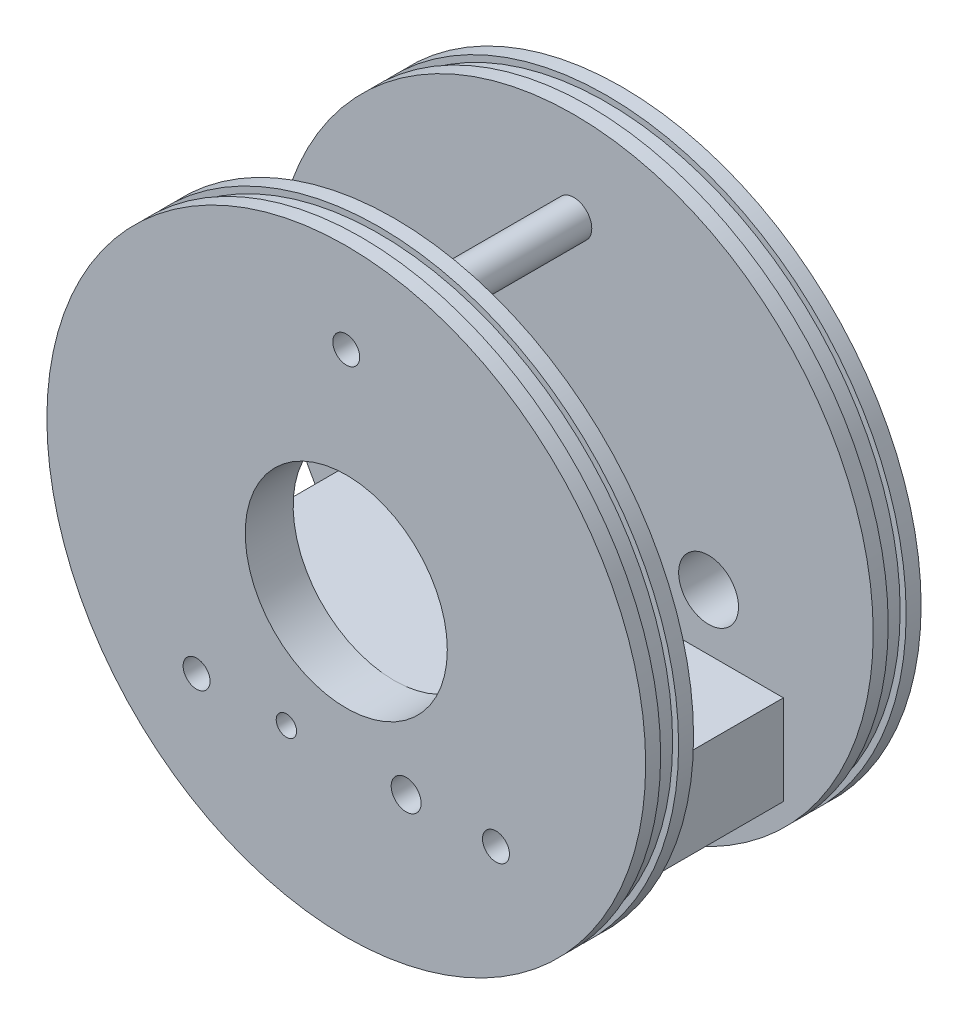
ISO-10303-21;
HEADER;
FILE_DESCRIPTION(('STEP AP214'),'2;1');
FILE_NAME('part.step','',(''),(''),'','','');
FILE_SCHEMA(('AUTOMOTIVE_DESIGN { 1 0 10303 214 1 1 1 1 }'));
ENDSEC;
DATA;
#1=APPLICATION_CONTEXT('core data for automotive mechanical design processes');
#2=APPLICATION_PROTOCOL_DEFINITION('international standard','automotive_design',2000,#1);
#3=PRODUCT_CONTEXT('',#1,'mechanical');
#4=PRODUCT('Part','Part','',(#3));
#5=PRODUCT_RELATED_PRODUCT_CATEGORY('part','',(#4));
#6=PRODUCT_DEFINITION_FORMATION('','',#4);
#7=PRODUCT_DEFINITION_CONTEXT('part definition',#1,'design');
#8=PRODUCT_DEFINITION('design','',#6,#7);
#9=PRODUCT_DEFINITION_SHAPE('','',#8);
#10=(LENGTH_UNIT() NAMED_UNIT(*) SI_UNIT(.MILLI.,.METRE.));
#11=(NAMED_UNIT(*) PLANE_ANGLE_UNIT() SI_UNIT($,.RADIAN.));
#12=(NAMED_UNIT(*) SI_UNIT($,.STERADIAN.) SOLID_ANGLE_UNIT());
#13=UNCERTAINTY_MEASURE_WITH_UNIT(LENGTH_MEASURE(1.E-05),#10,'distance_accuracy_value','');
#14=(GEOMETRIC_REPRESENTATION_CONTEXT(3) GLOBAL_UNCERTAINTY_ASSIGNED_CONTEXT((#13)) GLOBAL_UNIT_ASSIGNED_CONTEXT((#10,
#11,#12)) REPRESENTATION_CONTEXT('',''));
#15=CARTESIAN_POINT('',(0.,0.,0.));
#16=DIRECTION('',(0.,0.,1.));
#17=DIRECTION('',(1.,0.,0.));
#18=AXIS2_PLACEMENT_3D('',#15,#16,#17);
#19=CARTESIAN_POINT('',(0.,0.,-68.));
#20=DIRECTION('',(0.,0.,1.));
#21=DIRECTION('',(1.,0.,0.));
#22=AXIS2_PLACEMENT_3D('',#19,#20,#21);
#23=PLANE('',#22);
#24=CARTESIAN_POINT('',(45.,-15.,-68.));
#25=DIRECTION('',(0.,0.,1.));
#26=DIRECTION('',(1.,0.,0.));
#27=AXIS2_PLACEMENT_3D('',#24,#25,#26);
#28=CIRCLE('',#27,10.);
#29=CARTESIAN_POINT('',(55.,-15.,-68.));
#30=VERTEX_POINT('',#29);
#31=EDGE_CURVE('E337',#30,#30,#28,.T.);
#32=ORIENTED_EDGE('',*,*,#31,.F.);
#33=EDGE_LOOP('',(#32));
#34=FACE_BOUND('',#33,.T.);
#35=CARTESIAN_POINT('',(0.,0.,-68.));
#36=DIRECTION('',(0.,0.,1.));
#37=DIRECTION('',(1.,0.,0.));
#38=AXIS2_PLACEMENT_3D('',#35,#36,#37);
#39=CIRCLE('',#38,99.9999999999943);
#40=CARTESIAN_POINT('',(99.9999999999943,0.,-68.));
#41=VERTEX_POINT('',#40);
#42=EDGE_CURVE('E83',#41,#41,#39,.T.);
#43=ORIENTED_EDGE('',*,*,#42,.T.);
#44=EDGE_LOOP('',(#43));
#45=FACE_BOUND('',#44,.T.);
#46=CARTESIAN_POINT('',(0.,70.,-68.));
#47=DIRECTION('',(0.,0.,-1.));
#48=DIRECTION('',(-1.,0.,0.));
#49=AXIS2_PLACEMENT_3D('',#46,#47,#48);
#50=CIRCLE('',#49,6.);
#51=CARTESIAN_POINT('',(-6.,70.,-68.));
#52=VERTEX_POINT('',#51);
#53=EDGE_CURVE('E183',#52,#52,#50,.T.);
#54=ORIENTED_EDGE('',*,*,#53,.T.);
#55=EDGE_LOOP('',(#54));
#56=FACE_BOUND('',#55,.T.);
#57=DIRECTION('',(0.,1.,0.));
#58=VECTOR('',#57,1.);
#59=CARTESIAN_POINT('',(70.,-63.75,-68.));
#60=LINE('',#59,#58);
#61=CARTESIAN_POINT('',(70.,-63.75,-68.));
#62=VERTEX_POINT('',#61);
#63=CARTESIAN_POINT('',(70.,-33.75,-68.));
#64=VERTEX_POINT('',#63);
#65=EDGE_CURVE('E91',#62,#64,#60,.T.);
#66=ORIENTED_EDGE('',*,*,#65,.F.);
#67=DIRECTION('',(-1.,0.,0.));
#68=VECTOR('',#67,1.);
#69=CARTESIAN_POINT('',(70.,-63.75,-68.));
#70=LINE('',#69,#68);
#71=CARTESIAN_POINT('',(-70.,-63.7499999999999,-68.));
#72=VERTEX_POINT('',#71);
#73=EDGE_CURVE('E95',#62,#72,#70,.T.);
#74=ORIENTED_EDGE('',*,*,#73,.T.);
#75=DIRECTION('',(0.,1.,0.));
#76=VECTOR('',#75,1.);
#77=CARTESIAN_POINT('',(-70.,-63.7499999999999,-68.));
#78=LINE('',#77,#76);
#79=CARTESIAN_POINT('',(-70.,-33.7499999999999,-68.));
#80=VERTEX_POINT('',#79);
#81=EDGE_CURVE('E135',#72,#80,#78,.T.);
#82=ORIENTED_EDGE('',*,*,#81,.T.);
#83=DIRECTION('',(-1.,0.,0.));
#84=VECTOR('',#83,1.);
#85=CARTESIAN_POINT('',(70.,-33.75,-68.));
#86=LINE('',#85,#84);
#87=EDGE_CURVE('E270',#64,#80,#86,.T.);
#88=ORIENTED_EDGE('',*,*,#87,.F.);
#89=EDGE_LOOP('',(#66,#74,#82,#88));
#90=FACE_BOUND('',#89,.T.);
#91=ADVANCED_FACE('F73',(#34,#45,#56,#90),#23,.T.);
#92=CARTESIAN_POINT('',(0.,0.,-84.));
#93=DIRECTION('',(0.,0.,1.));
#94=DIRECTION('',(1.,0.,0.));
#95=AXIS2_PLACEMENT_3D('',#92,#93,#94);
#96=CYLINDRICAL_SURFACE('',#95,99.9999999999943);
#97=CARTESIAN_POINT('',(0.,0.,-73.));
#98=DIRECTION('',(0.,0.,1.));
#99=DIRECTION('',(1.,0.,0.));
#100=AXIS2_PLACEMENT_3D('',#97,#98,#99);
#101=CIRCLE('',#100,99.9999999999943);
#102=CARTESIAN_POINT('',(99.9999999999943,0.,-73.));
#103=VERTEX_POINT('',#102);
#104=EDGE_CURVE('E201',#103,#103,#101,.T.);
#105=ORIENTED_EDGE('',*,*,#104,.T.);
#106=EDGE_LOOP('',(#105));
#107=FACE_BOUND('',#106,.T.);
#108=ORIENTED_EDGE('',*,*,#42,.F.);
#109=EDGE_LOOP('',(#108));
#110=FACE_BOUND('',#109,.T.);
#111=ADVANCED_FACE('F75',(#107,#110),#96,.T.);
#112=CARTESIAN_POINT('',(0.,0.,-73.));
#113=DIRECTION('',(0.,0.,1.));
#114=DIRECTION('',(1.,0.,0.));
#115=AXIS2_PLACEMENT_3D('',#112,#113,#114);
#116=PLANE('',#115);
#117=ORIENTED_EDGE('',*,*,#104,.F.);
#118=EDGE_LOOP('',(#117));
#119=FACE_BOUND('',#118,.T.);
#120=CARTESIAN_POINT('',(0.,0.,-73.));
#121=DIRECTION('',(0.,0.,1.));
#122=DIRECTION('',(1.,0.,0.));
#123=AXIS2_PLACEMENT_3D('',#120,#121,#122);
#124=CIRCLE('',#123,97.999999999999);
#125=CARTESIAN_POINT('',(97.999999999999,0.,-73.));
#126=VERTEX_POINT('',#125);
#127=EDGE_CURVE('E197',#126,#126,#124,.T.);
#128=ORIENTED_EDGE('',*,*,#127,.T.);
#129=EDGE_LOOP('',(#128));
#130=FACE_BOUND('',#129,.T.);
#131=ADVANCED_FACE('F303',(#119,#130),#116,.F.);
#132=CARTESIAN_POINT('',(0.,0.,-73.));
#133=DIRECTION('',(0.,0.,-1.));
#134=DIRECTION('',(-1.,0.,0.));
#135=AXIS2_PLACEMENT_3D('',#132,#133,#134);
#136=CYLINDRICAL_SURFACE('',#135,97.999999999999);
#137=ORIENTED_EDGE('',*,*,#127,.F.);
#138=EDGE_LOOP('',(#137));
#139=FACE_BOUND('',#138,.T.);
#140=CARTESIAN_POINT('',(0.,0.,-79.));
#141=DIRECTION('',(0.,0.,1.));
#142=DIRECTION('',(1.,0.,0.));
#143=AXIS2_PLACEMENT_3D('',#140,#141,#142);
#144=CIRCLE('',#143,97.999999999999);
#145=CARTESIAN_POINT('',(97.999999999999,0.,-79.));
#146=VERTEX_POINT('',#145);
#147=EDGE_CURVE('E188',#146,#146,#144,.T.);
#148=ORIENTED_EDGE('',*,*,#147,.T.);
#149=EDGE_LOOP('',(#148));
#150=FACE_BOUND('',#149,.T.);
#151=ADVANCED_FACE('F319',(#139,#150),#136,.T.);
#152=CARTESIAN_POINT('',(0.,0.,-79.));
#153=DIRECTION('',(0.,0.,1.));
#154=DIRECTION('',(1.,0.,0.));
#155=AXIS2_PLACEMENT_3D('',#152,#153,#154);
#156=PLANE('',#155);
#157=ORIENTED_EDGE('',*,*,#147,.F.);
#158=EDGE_LOOP('',(#157));
#159=FACE_BOUND('',#158,.T.);
#160=CARTESIAN_POINT('',(0.,0.,-79.));
#161=DIRECTION('',(0.,0.,1.));
#162=DIRECTION('',(1.,0.,0.));
#163=AXIS2_PLACEMENT_3D('',#160,#161,#162);
#164=CIRCLE('',#163,99.9999999999943);
#165=CARTESIAN_POINT('',(99.9999999999943,0.,-79.));
#166=VERTEX_POINT('',#165);
#167=EDGE_CURVE('E192',#166,#166,#164,.T.);
#168=ORIENTED_EDGE('',*,*,#167,.T.);
#169=EDGE_LOOP('',(#168));
#170=FACE_BOUND('',#169,.T.);
#171=ADVANCED_FACE('F311',(#159,#170),#156,.T.);
#172=CARTESIAN_POINT('',(0.,0.,-84.));
#173=DIRECTION('',(0.,0.,1.));
#174=DIRECTION('',(1.,0.,0.));
#175=AXIS2_PLACEMENT_3D('',#172,#173,#174);
#176=PLANE('',#175);
#177=CARTESIAN_POINT('',(45.,-15.,-84.));
#178=DIRECTION('',(0.,0.,-1.));
#179=DIRECTION('',(-1.,0.,0.));
#180=AXIS2_PLACEMENT_3D('',#177,#178,#179);
#181=CIRCLE('',#180,10.);
#182=CARTESIAN_POINT('',(35.,-15.,-84.));
#183=VERTEX_POINT('',#182);
#184=EDGE_CURVE('E325',#183,#183,#181,.T.);
#185=ORIENTED_EDGE('',*,*,#184,.F.);
#186=EDGE_LOOP('',(#185));
#187=FACE_BOUND('',#186,.T.);
#188=CARTESIAN_POINT('',(0.,70.,-84.));
#189=DIRECTION('',(0.,0.,1.));
#190=DIRECTION('',(1.,0.,0.));
#191=AXIS2_PLACEMENT_3D('',#188,#189,#190);
#192=CIRCLE('',#191,4.5);
#193=CARTESIAN_POINT('',(4.5,70.,-84.));
#194=VERTEX_POINT('',#193);
#195=EDGE_CURVE('E328',#194,#194,#192,.F.);
#196=ORIENTED_EDGE('',*,*,#195,.F.);
#197=EDGE_LOOP('',(#196));
#198=FACE_BOUND('',#197,.T.);
#199=CARTESIAN_POINT('',(-50.,-48.75,-84.));
#200=DIRECTION('',(0.,0.,1.));
#201=DIRECTION('',(1.,0.,0.));
#202=AXIS2_PLACEMENT_3D('',#199,#200,#201);
#203=CIRCLE('',#202,4.5);
#204=CARTESIAN_POINT('',(-45.5,-48.75,-84.));
#205=VERTEX_POINT('',#204);
#206=EDGE_CURVE('E193',#205,#205,#203,.T.);
#207=ORIENTED_EDGE('',*,*,#206,.T.);
#208=EDGE_LOOP('',(#207));
#209=FACE_BOUND('',#208,.T.);
#210=CARTESIAN_POINT('',(50.,-48.75,-84.));
#211=DIRECTION('',(0.,0.,1.));
#212=DIRECTION('',(1.,0.,0.));
#213=AXIS2_PLACEMENT_3D('',#210,#211,#212);
#214=CIRCLE('',#213,4.5);
#215=CARTESIAN_POINT('',(54.5,-48.75,-84.));
#216=VERTEX_POINT('',#215);
#217=EDGE_CURVE('E215',#216,#216,#214,.T.);
#218=ORIENTED_EDGE('',*,*,#217,.T.);
#219=EDGE_LOOP('',(#218));
#220=FACE_BOUND('',#219,.T.);
#221=CARTESIAN_POINT('',(-20.,-48.75,-84.));
#222=DIRECTION('',(0.,0.,1.));
#223=DIRECTION('',(1.,0.,0.));
#224=AXIS2_PLACEMENT_3D('',#221,#222,#223);
#225=CIRCLE('',#224,3.4);
#226=CARTESIAN_POINT('',(-16.6,-48.75,-84.));
#227=VERTEX_POINT('',#226);
#228=EDGE_CURVE('E211',#227,#227,#225,.T.);
#229=ORIENTED_EDGE('',*,*,#228,.T.);
#230=EDGE_LOOP('',(#229));
#231=FACE_BOUND('',#230,.T.);
#232=CARTESIAN_POINT('',(20.,-48.75,-84.));
#233=DIRECTION('',(0.,0.,1.));
#234=DIRECTION('',(1.,0.,0.));
#235=AXIS2_PLACEMENT_3D('',#232,#233,#234);
#236=CIRCLE('',#235,5.);
#237=CARTESIAN_POINT('',(25.,-48.75,-84.));
#238=VERTEX_POINT('',#237);
#239=EDGE_CURVE('E187',#238,#238,#236,.T.);
#240=ORIENTED_EDGE('',*,*,#239,.T.);
#241=EDGE_LOOP('',(#240));
#242=FACE_BOUND('',#241,.T.);
#243=CARTESIAN_POINT('',(0.,0.,-84.));
#244=DIRECTION('',(0.,0.,1.));
#245=DIRECTION('',(1.,0.,0.));
#246=AXIS2_PLACEMENT_3D('',#243,#244,#245);
#247=CIRCLE('',#246,99.9999999999943);
#248=CARTESIAN_POINT('',(99.9999999999943,0.,-84.));
#249=VERTEX_POINT('',#248);
#250=EDGE_CURVE('E12',#249,#249,#247,.T.);
#251=ORIENTED_EDGE('',*,*,#250,.F.);
#252=EDGE_LOOP('',(#251));
#253=FACE_BOUND('',#252,.T.);
#254=ADVANCED_FACE('F222',(#187,#198,#209,#220,#231,#242,#253),#176,.F.);
#255=ORIENTED_EDGE('',*,*,#250,.T.);
#256=EDGE_LOOP('',(#255));
#257=FACE_BOUND('',#256,.T.);
#258=ORIENTED_EDGE('',*,*,#167,.F.);
#259=EDGE_LOOP('',(#258));
#260=FACE_BOUND('',#259,.T.);
#261=ADVANCED_FACE('F305',(#257,#260),#96,.T.);
#262=CARTESIAN_POINT('',(20.,-48.75,-159.));
#263=DIRECTION('',(0.,0.,1.));
#264=DIRECTION('',(1.,0.,0.));
#265=AXIS2_PLACEMENT_3D('',#262,#263,#264);
#266=CYLINDRICAL_SURFACE('',#265,5.);
#267=CARTESIAN_POINT('',(20.,-48.75,8.));
#268=DIRECTION('',(0.,0.,1.));
#269=DIRECTION('',(1.,0.,0.));
#270=AXIS2_PLACEMENT_3D('',#267,#268,#269);
#271=CIRCLE('',#270,5.);
#272=CARTESIAN_POINT('',(25.,-48.75,8.00000000000001));
#273=VERTEX_POINT('',#272);
#274=EDGE_CURVE('E254',#273,#273,#271,.T.);
#275=CARTESIAN_POINT('',(25.,-48.75,-84.));
#276=CARTESIAN_POINT('',(25.,-48.75,-83.0416666666667));
#277=CARTESIAN_POINT('',(25.,-48.75,-82.0833333333333));
#278=CARTESIAN_POINT('',(25.,-48.75,-80.1666666666667));
#279=CARTESIAN_POINT('',(25.,-48.75,-79.2083333333333));
#280=CARTESIAN_POINT('',(25.,-48.75,-77.2916666666667));
#281=CARTESIAN_POINT('',(25.,-48.75,-76.3333333333333));
#282=CARTESIAN_POINT('',(25.,-48.75,-74.4166666666667));
#283=CARTESIAN_POINT('',(25.,-48.75,-73.4583333333333));
#284=CARTESIAN_POINT('',(25.,-48.75,-71.5416666666667));
#285=CARTESIAN_POINT('',(25.,-48.75,-70.5833333333333));
#286=CARTESIAN_POINT('',(25.,-48.75,-68.6666666666667));
#287=CARTESIAN_POINT('',(25.,-48.75,-67.7083333333333));
#288=CARTESIAN_POINT('',(25.,-48.75,-65.7916666666667));
#289=CARTESIAN_POINT('',(25.,-48.75,-64.8333333333333));
#290=CARTESIAN_POINT('',(25.,-48.75,-62.9166666666667));
#291=CARTESIAN_POINT('',(25.,-48.75,-61.9583333333333));
#292=CARTESIAN_POINT('',(25.,-48.75,-60.0416666666667));
#293=CARTESIAN_POINT('',(25.,-48.75,-59.0833333333333));
#294=CARTESIAN_POINT('',(25.,-48.75,-57.1666666666667));
#295=CARTESIAN_POINT('',(25.,-48.75,-56.2083333333333));
#296=CARTESIAN_POINT('',(25.,-48.75,-54.2916666666667));
#297=CARTESIAN_POINT('',(25.,-48.75,-53.3333333333333));
#298=CARTESIAN_POINT('',(25.,-48.75,-51.4166666666667));
#299=CARTESIAN_POINT('',(25.,-48.75,-50.4583333333333));
#300=CARTESIAN_POINT('',(25.,-48.75,-48.5416666666667));
#301=CARTESIAN_POINT('',(25.,-48.75,-47.5833333333333));
#302=CARTESIAN_POINT('',(25.,-48.75,-45.6666666666667));
#303=CARTESIAN_POINT('',(25.,-48.75,-44.7083333333333));
#304=CARTESIAN_POINT('',(25.,-48.75,-42.7916666666667));
#305=CARTESIAN_POINT('',(25.,-48.75,-41.8333333333333));
#306=CARTESIAN_POINT('',(25.,-48.75,-39.9166666666667));
#307=CARTESIAN_POINT('',(25.,-48.75,-38.9583333333333));
#308=CARTESIAN_POINT('',(25.,-48.75,-37.0416666666667));
#309=CARTESIAN_POINT('',(25.,-48.75,-36.0833333333333));
#310=CARTESIAN_POINT('',(25.,-48.75,-34.1666666666667));
#311=CARTESIAN_POINT('',(25.,-48.75,-33.2083333333333));
#312=CARTESIAN_POINT('',(25.,-48.75,-31.2916666666667));
#313=CARTESIAN_POINT('',(25.,-48.75,-30.3333333333333));
#314=CARTESIAN_POINT('',(25.,-48.75,-28.4166666666667));
#315=CARTESIAN_POINT('',(25.,-48.75,-27.4583333333333));
#316=CARTESIAN_POINT('',(25.,-48.75,-25.5416666666667));
#317=CARTESIAN_POINT('',(25.,-48.75,-24.5833333333333));
#318=CARTESIAN_POINT('',(25.,-48.75,-22.6666666666667));
#319=CARTESIAN_POINT('',(25.,-48.75,-21.7083333333333));
#320=CARTESIAN_POINT('',(25.,-48.75,-19.7916666666667));
#321=CARTESIAN_POINT('',(25.,-48.75,-18.8333333333333));
#322=CARTESIAN_POINT('',(25.,-48.75,-16.9166666666667));
#323=CARTESIAN_POINT('',(25.,-48.75,-15.9583333333333));
#324=CARTESIAN_POINT('',(25.,-48.75,-14.0416666666667));
#325=CARTESIAN_POINT('',(25.,-48.75,-13.0833333333333));
#326=CARTESIAN_POINT('',(25.,-48.75,-11.1666666666667));
#327=CARTESIAN_POINT('',(25.,-48.75,-10.2083333333333));
#328=CARTESIAN_POINT('',(25.,-48.75,-8.29166666666665));
#329=CARTESIAN_POINT('',(25.,-48.75,-7.33333333333332));
#330=CARTESIAN_POINT('',(25.,-48.75,-5.41666666666666));
#331=CARTESIAN_POINT('',(25.,-48.75,-4.45833333333333));
#332=CARTESIAN_POINT('',(25.,-48.75,-2.54166666666666));
#333=CARTESIAN_POINT('',(25.,-48.75,-1.58333333333333));
#334=CARTESIAN_POINT('',(25.,-48.75,0.333333333333343));
#335=CARTESIAN_POINT('',(25.,-48.75,1.29166666666667));
#336=CARTESIAN_POINT('',(25.,-48.75,3.20833333333333));
#337=CARTESIAN_POINT('',(25.,-48.75,4.16666666666666));
#338=CARTESIAN_POINT('',(25.,-48.75,6.08333333333333));
#339=CARTESIAN_POINT('',(25.,-48.75,7.04166666666667));
#340=CARTESIAN_POINT('',(25.,-48.75,8.00000000000001));
#341=B_SPLINE_CURVE_WITH_KNOTS('',3,(#275,#276,#277,#278,#279,#280,#281,#282,#283,#284,#285,
#286,#287,#288,#289,#290,#291,#292,#293,#294,#295,#296,#297,#298,#299,#300,#301,#302,#303,#304,
#305,#306,#307,#308,#309,#310,#311,#312,#313,#314,#315,#316,#317,#318,#319,#320,#321,#322,#323,
#324,#325,#326,#327,#328,#329,#330,#331,#332,#333,#334,#335,#336,#337,#338,#339,#340),
.UNSPECIFIED.,.F.,.F.,(4,2,2,2,2,2,2,2,2,2,2,2,2,2,2,2,2,2,2,2,2,2,2,2,2,2,2,2,2,2,2,2,4),(0.,
2.875,5.75000000000001,8.62500000000001,11.5,14.375,17.25,20.125,23.,25.875,28.75,31.625,34.5,
37.375,40.25,43.125,46.,48.875,51.75,54.625,57.5,60.375,63.25,66.125,69.,71.875,74.75,77.625,
80.5,83.375,86.25,89.125,92.),.UNSPECIFIED.);
#342=EDGE_CURVE('BSEAM317',#238,#273,#341,.T.);
#343=ORIENTED_EDGE('',*,*,#239,.F.);
#344=ORIENTED_EDGE('',*,*,#274,.T.);
#345=ORIENTED_EDGE('',*,*,#342,.T.);
#346=ORIENTED_EDGE('',*,*,#342,.F.);
#347=EDGE_LOOP('',(#343,#345,#344,#346));
#348=FACE_BOUND('',#347,.T.);
#349=ADVANCED_FACE('F317',(#348),#266,.F.);
#350=CARTESIAN_POINT('',(-20.,-48.75,-159.));
#351=DIRECTION('',(0.,0.,1.));
#352=DIRECTION('',(1.,0.,0.));
#353=AXIS2_PLACEMENT_3D('',#350,#351,#352);
#354=CYLINDRICAL_SURFACE('',#353,3.4);
#355=CARTESIAN_POINT('',(-20.,-48.75,8.));
#356=DIRECTION('',(0.,0.,1.));
#357=DIRECTION('',(1.,0.,0.));
#358=AXIS2_PLACEMENT_3D('',#355,#356,#357);
#359=CIRCLE('',#358,3.4);
#360=CARTESIAN_POINT('',(-16.6,-48.75,8.00000000000001));
#361=VERTEX_POINT('',#360);
#362=EDGE_CURVE('E245',#361,#361,#359,.T.);
#363=CARTESIAN_POINT('',(-16.6,-48.75,-84.));
#364=CARTESIAN_POINT('',(-16.6,-48.75,-83.0416666666667));
#365=CARTESIAN_POINT('',(-16.6,-48.75,-82.0833333333333));
#366=CARTESIAN_POINT('',(-16.6,-48.75,-80.1666666666667));
#367=CARTESIAN_POINT('',(-16.6,-48.75,-79.2083333333333));
#368=CARTESIAN_POINT('',(-16.6,-48.75,-77.2916666666667));
#369=CARTESIAN_POINT('',(-16.6,-48.75,-76.3333333333333));
#370=CARTESIAN_POINT('',(-16.6,-48.75,-74.4166666666667));
#371=CARTESIAN_POINT('',(-16.6,-48.75,-73.4583333333333));
#372=CARTESIAN_POINT('',(-16.6,-48.75,-71.5416666666667));
#373=CARTESIAN_POINT('',(-16.6,-48.75,-70.5833333333333));
#374=CARTESIAN_POINT('',(-16.6,-48.75,-68.6666666666667));
#375=CARTESIAN_POINT('',(-16.6,-48.75,-67.7083333333333));
#376=CARTESIAN_POINT('',(-16.6,-48.75,-65.7916666666667));
#377=CARTESIAN_POINT('',(-16.6,-48.75,-64.8333333333333));
#378=CARTESIAN_POINT('',(-16.6,-48.75,-62.9166666666667));
#379=CARTESIAN_POINT('',(-16.6,-48.75,-61.9583333333333));
#380=CARTESIAN_POINT('',(-16.6,-48.75,-60.0416666666667));
#381=CARTESIAN_POINT('',(-16.6,-48.75,-59.0833333333333));
#382=CARTESIAN_POINT('',(-16.6,-48.75,-57.1666666666667));
#383=CARTESIAN_POINT('',(-16.6,-48.75,-56.2083333333333));
#384=CARTESIAN_POINT('',(-16.6,-48.75,-54.2916666666667));
#385=CARTESIAN_POINT('',(-16.6,-48.75,-53.3333333333333));
#386=CARTESIAN_POINT('',(-16.6,-48.75,-51.4166666666667));
#387=CARTESIAN_POINT('',(-16.6,-48.75,-50.4583333333333));
#388=CARTESIAN_POINT('',(-16.6,-48.75,-48.5416666666667));
#389=CARTESIAN_POINT('',(-16.6,-48.75,-47.5833333333333));
#390=CARTESIAN_POINT('',(-16.6,-48.75,-45.6666666666667));
#391=CARTESIAN_POINT('',(-16.6,-48.75,-44.7083333333333));
#392=CARTESIAN_POINT('',(-16.6,-48.75,-42.7916666666667));
#393=CARTESIAN_POINT('',(-16.6,-48.75,-41.8333333333333));
#394=CARTESIAN_POINT('',(-16.6,-48.75,-39.9166666666667));
#395=CARTESIAN_POINT('',(-16.6,-48.75,-38.9583333333333));
#396=CARTESIAN_POINT('',(-16.6,-48.75,-37.0416666666667));
#397=CARTESIAN_POINT('',(-16.6,-48.75,-36.0833333333333));
#398=CARTESIAN_POINT('',(-16.6,-48.75,-34.1666666666667));
#399=CARTESIAN_POINT('',(-16.6,-48.75,-33.2083333333333));
#400=CARTESIAN_POINT('',(-16.6,-48.75,-31.2916666666667));
#401=CARTESIAN_POINT('',(-16.6,-48.75,-30.3333333333333));
#402=CARTESIAN_POINT('',(-16.6,-48.75,-28.4166666666667));
#403=CARTESIAN_POINT('',(-16.6,-48.75,-27.4583333333333));
#404=CARTESIAN_POINT('',(-16.6,-48.75,-25.5416666666667));
#405=CARTESIAN_POINT('',(-16.6,-48.75,-24.5833333333333));
#406=CARTESIAN_POINT('',(-16.6,-48.75,-22.6666666666667));
#407=CARTESIAN_POINT('',(-16.6,-48.75,-21.7083333333333));
#408=CARTESIAN_POINT('',(-16.6,-48.75,-19.7916666666667));
#409=CARTESIAN_POINT('',(-16.6,-48.75,-18.8333333333333));
#410=CARTESIAN_POINT('',(-16.6,-48.75,-16.9166666666667));
#411=CARTESIAN_POINT('',(-16.6,-48.75,-15.9583333333333));
#412=CARTESIAN_POINT('',(-16.6,-48.75,-14.0416666666667));
#413=CARTESIAN_POINT('',(-16.6,-48.75,-13.0833333333333));
#414=CARTESIAN_POINT('',(-16.6,-48.75,-11.1666666666667));
#415=CARTESIAN_POINT('',(-16.6,-48.75,-10.2083333333333));
#416=CARTESIAN_POINT('',(-16.6,-48.75,-8.29166666666665));
#417=CARTESIAN_POINT('',(-16.6,-48.75,-7.33333333333332));
#418=CARTESIAN_POINT('',(-16.6,-48.75,-5.41666666666666));
#419=CARTESIAN_POINT('',(-16.6,-48.75,-4.45833333333333));
#420=CARTESIAN_POINT('',(-16.6,-48.75,-2.54166666666666));
#421=CARTESIAN_POINT('',(-16.6,-48.75,-1.58333333333333));
#422=CARTESIAN_POINT('',(-16.6,-48.75,0.333333333333343));
#423=CARTESIAN_POINT('',(-16.6,-48.75,1.29166666666667));
#424=CARTESIAN_POINT('',(-16.6,-48.75,3.20833333333333));
#425=CARTESIAN_POINT('',(-16.6,-48.75,4.16666666666666));
#426=CARTESIAN_POINT('',(-16.6,-48.75,6.08333333333333));
#427=CARTESIAN_POINT('',(-16.6,-48.75,7.04166666666667));
#428=CARTESIAN_POINT('',(-16.6,-48.75,8.00000000000001));
#429=B_SPLINE_CURVE_WITH_KNOTS('',3,(#363,#364,#365,#366,#367,#368,#369,#370,#371,#372,#373,
#374,#375,#376,#377,#378,#379,#380,#381,#382,#383,#384,#385,#386,#387,#388,#389,#390,#391,#392,
#393,#394,#395,#396,#397,#398,#399,#400,#401,#402,#403,#404,#405,#406,#407,#408,#409,#410,#411,
#412,#413,#414,#415,#416,#417,#418,#419,#420,#421,#422,#423,#424,#425,#426,#427,#428),
.UNSPECIFIED.,.F.,.F.,(4,2,2,2,2,2,2,2,2,2,2,2,2,2,2,2,2,2,2,2,2,2,2,2,2,2,2,2,2,2,2,2,4),(0.,
2.875,5.75000000000001,8.62500000000001,11.5,14.375,17.25,20.125,23.,25.875,28.75,31.625,34.5,
37.375,40.25,43.125,46.,48.875,51.75,54.625,57.5,60.375,63.25,66.125,69.,71.875,74.75,77.625,
80.5,83.375,86.25,89.125,92.),.UNSPECIFIED.);
#430=EDGE_CURVE('BSEAM424',#227,#361,#429,.T.);
#431=ORIENTED_EDGE('',*,*,#228,.F.);
#432=ORIENTED_EDGE('',*,*,#362,.T.);
#433=ORIENTED_EDGE('',*,*,#430,.T.);
#434=ORIENTED_EDGE('',*,*,#430,.F.);
#435=EDGE_LOOP('',(#431,#433,#432,#434));
#436=FACE_BOUND('',#435,.T.);
#437=ADVANCED_FACE('F424',(#436),#354,.F.);
#438=CARTESIAN_POINT('',(50.,-48.75,-159.));
#439=DIRECTION('',(0.,0.,1.));
#440=DIRECTION('',(1.,0.,0.));
#441=AXIS2_PLACEMENT_3D('',#438,#439,#440);
#442=CYLINDRICAL_SURFACE('',#441,4.5);
#443=CARTESIAN_POINT('',(50.,-48.75,8.));
#444=DIRECTION('',(0.,0.,1.));
#445=DIRECTION('',(1.,0.,0.));
#446=AXIS2_PLACEMENT_3D('',#443,#444,#445);
#447=CIRCLE('',#446,4.5);
#448=CARTESIAN_POINT('',(54.5,-48.75,8.00000000000001));
#449=VERTEX_POINT('',#448);
#450=EDGE_CURVE('E237',#449,#449,#447,.T.);
#451=CARTESIAN_POINT('',(54.5,-48.75,-84.));
#452=CARTESIAN_POINT('',(54.5,-48.75,-83.0416666666667));
#453=CARTESIAN_POINT('',(54.5,-48.75,-82.0833333333333));
#454=CARTESIAN_POINT('',(54.5,-48.75,-80.1666666666667));
#455=CARTESIAN_POINT('',(54.5,-48.75,-79.2083333333333));
#456=CARTESIAN_POINT('',(54.5,-48.75,-77.2916666666667));
#457=CARTESIAN_POINT('',(54.5,-48.75,-76.3333333333333));
#458=CARTESIAN_POINT('',(54.5,-48.75,-74.4166666666667));
#459=CARTESIAN_POINT('',(54.5,-48.75,-73.4583333333333));
#460=CARTESIAN_POINT('',(54.5,-48.75,-71.5416666666667));
#461=CARTESIAN_POINT('',(54.5,-48.75,-70.5833333333333));
#462=CARTESIAN_POINT('',(54.5,-48.75,-68.6666666666667));
#463=CARTESIAN_POINT('',(54.5,-48.75,-67.7083333333333));
#464=CARTESIAN_POINT('',(54.5,-48.75,-65.7916666666667));
#465=CARTESIAN_POINT('',(54.5,-48.75,-64.8333333333333));
#466=CARTESIAN_POINT('',(54.5,-48.75,-62.9166666666667));
#467=CARTESIAN_POINT('',(54.5,-48.75,-61.9583333333333));
#468=CARTESIAN_POINT('',(54.5,-48.75,-60.0416666666667));
#469=CARTESIAN_POINT('',(54.5,-48.75,-59.0833333333333));
#470=CARTESIAN_POINT('',(54.5,-48.75,-57.1666666666667));
#471=CARTESIAN_POINT('',(54.5,-48.75,-56.2083333333333));
#472=CARTESIAN_POINT('',(54.5,-48.75,-54.2916666666667));
#473=CARTESIAN_POINT('',(54.5,-48.75,-53.3333333333333));
#474=CARTESIAN_POINT('',(54.5,-48.75,-51.4166666666667));
#475=CARTESIAN_POINT('',(54.5,-48.75,-50.4583333333333));
#476=CARTESIAN_POINT('',(54.5,-48.75,-48.5416666666667));
#477=CARTESIAN_POINT('',(54.5,-48.75,-47.5833333333333));
#478=CARTESIAN_POINT('',(54.5,-48.75,-45.6666666666667));
#479=CARTESIAN_POINT('',(54.5,-48.75,-44.7083333333333));
#480=CARTESIAN_POINT('',(54.5,-48.75,-42.7916666666667));
#481=CARTESIAN_POINT('',(54.5,-48.75,-41.8333333333333));
#482=CARTESIAN_POINT('',(54.5,-48.75,-39.9166666666667));
#483=CARTESIAN_POINT('',(54.5,-48.75,-38.9583333333333));
#484=CARTESIAN_POINT('',(54.5,-48.75,-37.0416666666667));
#485=CARTESIAN_POINT('',(54.5,-48.75,-36.0833333333333));
#486=CARTESIAN_POINT('',(54.5,-48.75,-34.1666666666667));
#487=CARTESIAN_POINT('',(54.5,-48.75,-33.2083333333333));
#488=CARTESIAN_POINT('',(54.5,-48.75,-31.2916666666667));
#489=CARTESIAN_POINT('',(54.5,-48.75,-30.3333333333333));
#490=CARTESIAN_POINT('',(54.5,-48.75,-28.4166666666667));
#491=CARTESIAN_POINT('',(54.5,-48.75,-27.4583333333333));
#492=CARTESIAN_POINT('',(54.5,-48.75,-25.5416666666667));
#493=CARTESIAN_POINT('',(54.5,-48.75,-24.5833333333333));
#494=CARTESIAN_POINT('',(54.5,-48.75,-22.6666666666667));
#495=CARTESIAN_POINT('',(54.5,-48.75,-21.7083333333333));
#496=CARTESIAN_POINT('',(54.5,-48.75,-19.7916666666667));
#497=CARTESIAN_POINT('',(54.5,-48.75,-18.8333333333333));
#498=CARTESIAN_POINT('',(54.5,-48.75,-16.9166666666667));
#499=CARTESIAN_POINT('',(54.5,-48.75,-15.9583333333333));
#500=CARTESIAN_POINT('',(54.5,-48.75,-14.0416666666667));
#501=CARTESIAN_POINT('',(54.5,-48.75,-13.0833333333333));
#502=CARTESIAN_POINT('',(54.5,-48.75,-11.1666666666667));
#503=CARTESIAN_POINT('',(54.5,-48.75,-10.2083333333333));
#504=CARTESIAN_POINT('',(54.5,-48.75,-8.29166666666665));
#505=CARTESIAN_POINT('',(54.5,-48.75,-7.33333333333332));
#506=CARTESIAN_POINT('',(54.5,-48.75,-5.41666666666666));
#507=CARTESIAN_POINT('',(54.5,-48.75,-4.45833333333333));
#508=CARTESIAN_POINT('',(54.5,-48.75,-2.54166666666666));
#509=CARTESIAN_POINT('',(54.5,-48.75,-1.58333333333333));
#510=CARTESIAN_POINT('',(54.5,-48.75,0.333333333333343));
#511=CARTESIAN_POINT('',(54.5,-48.75,1.29166666666667));
#512=CARTESIAN_POINT('',(54.5,-48.75,3.20833333333333));
#513=CARTESIAN_POINT('',(54.5,-48.75,4.16666666666666));
#514=CARTESIAN_POINT('',(54.5,-48.75,6.08333333333333));
#515=CARTESIAN_POINT('',(54.5,-48.75,7.04166666666667));
#516=CARTESIAN_POINT('',(54.5,-48.75,8.00000000000001));
#517=B_SPLINE_CURVE_WITH_KNOTS('',3,(#451,#452,#453,#454,#455,#456,#457,#458,#459,#460,#461,
#462,#463,#464,#465,#466,#467,#468,#469,#470,#471,#472,#473,#474,#475,#476,#477,#478,#479,#480,
#481,#482,#483,#484,#485,#486,#487,#488,#489,#490,#491,#492,#493,#494,#495,#496,#497,#498,#499,
#500,#501,#502,#503,#504,#505,#506,#507,#508,#509,#510,#511,#512,#513,#514,#515,#516),
.UNSPECIFIED.,.F.,.F.,(4,2,2,2,2,2,2,2,2,2,2,2,2,2,2,2,2,2,2,2,2,2,2,2,2,2,2,2,2,2,2,2,4),(0.,
2.875,5.75000000000001,8.62500000000001,11.5,14.375,17.25,20.125,23.,25.875,28.75,31.625,34.5,
37.375,40.25,43.125,46.,48.875,51.75,54.625,57.5,60.375,63.25,66.125,69.,71.875,74.75,77.625,
80.5,83.375,86.25,89.125,92.),.UNSPECIFIED.);
#518=EDGE_CURVE('BSEAM229',#216,#449,#517,.T.);
#519=ORIENTED_EDGE('',*,*,#217,.F.);
#520=ORIENTED_EDGE('',*,*,#450,.T.);
#521=ORIENTED_EDGE('',*,*,#518,.T.);
#522=ORIENTED_EDGE('',*,*,#518,.F.);
#523=EDGE_LOOP('',(#519,#521,#520,#522));
#524=FACE_BOUND('',#523,.T.);
#525=ADVANCED_FACE('F229',(#524),#442,.F.);
#526=CARTESIAN_POINT('',(-50.,-48.75,-159.));
#527=DIRECTION('',(0.,0.,1.));
#528=DIRECTION('',(1.,0.,0.));
#529=AXIS2_PLACEMENT_3D('',#526,#527,#528);
#530=CYLINDRICAL_SURFACE('',#529,4.5);
#531=CARTESIAN_POINT('',(-50.,-48.75,8.));
#532=DIRECTION('',(0.,0.,1.));
#533=DIRECTION('',(1.,0.,0.));
#534=AXIS2_PLACEMENT_3D('',#531,#532,#533);
#535=CIRCLE('',#534,4.5);
#536=CARTESIAN_POINT('',(-45.5,-48.75,8.00000000000001));
#537=VERTEX_POINT('',#536);
#538=EDGE_CURVE('E233',#537,#537,#535,.T.);
#539=CARTESIAN_POINT('',(-45.5,-48.75,-84.));
#540=CARTESIAN_POINT('',(-45.5,-48.75,-83.0416666666667));
#541=CARTESIAN_POINT('',(-45.5,-48.75,-82.0833333333333));
#542=CARTESIAN_POINT('',(-45.5,-48.75,-80.1666666666667));
#543=CARTESIAN_POINT('',(-45.5,-48.75,-79.2083333333333));
#544=CARTESIAN_POINT('',(-45.5,-48.75,-77.2916666666667));
#545=CARTESIAN_POINT('',(-45.5,-48.75,-76.3333333333333));
#546=CARTESIAN_POINT('',(-45.5,-48.75,-74.4166666666667));
#547=CARTESIAN_POINT('',(-45.5,-48.75,-73.4583333333333));
#548=CARTESIAN_POINT('',(-45.5,-48.75,-71.5416666666667));
#549=CARTESIAN_POINT('',(-45.5,-48.75,-70.5833333333333));
#550=CARTESIAN_POINT('',(-45.5,-48.75,-68.6666666666667));
#551=CARTESIAN_POINT('',(-45.5,-48.75,-67.7083333333333));
#552=CARTESIAN_POINT('',(-45.5,-48.75,-65.7916666666667));
#553=CARTESIAN_POINT('',(-45.5,-48.75,-64.8333333333333));
#554=CARTESIAN_POINT('',(-45.5,-48.75,-62.9166666666667));
#555=CARTESIAN_POINT('',(-45.5,-48.75,-61.9583333333333));
#556=CARTESIAN_POINT('',(-45.5,-48.75,-60.0416666666667));
#557=CARTESIAN_POINT('',(-45.5,-48.75,-59.0833333333333));
#558=CARTESIAN_POINT('',(-45.5,-48.75,-57.1666666666667));
#559=CARTESIAN_POINT('',(-45.5,-48.75,-56.2083333333333));
#560=CARTESIAN_POINT('',(-45.5,-48.75,-54.2916666666667));
#561=CARTESIAN_POINT('',(-45.5,-48.75,-53.3333333333333));
#562=CARTESIAN_POINT('',(-45.5,-48.75,-51.4166666666667));
#563=CARTESIAN_POINT('',(-45.5,-48.75,-50.4583333333333));
#564=CARTESIAN_POINT('',(-45.5,-48.75,-48.5416666666667));
#565=CARTESIAN_POINT('',(-45.5,-48.75,-47.5833333333333));
#566=CARTESIAN_POINT('',(-45.5,-48.75,-45.6666666666667));
#567=CARTESIAN_POINT('',(-45.5,-48.75,-44.7083333333333));
#568=CARTESIAN_POINT('',(-45.5,-48.75,-42.7916666666667));
#569=CARTESIAN_POINT('',(-45.5,-48.75,-41.8333333333333));
#570=CARTESIAN_POINT('',(-45.5,-48.75,-39.9166666666667));
#571=CARTESIAN_POINT('',(-45.5,-48.75,-38.9583333333333));
#572=CARTESIAN_POINT('',(-45.5,-48.75,-37.0416666666667));
#573=CARTESIAN_POINT('',(-45.5,-48.75,-36.0833333333333));
#574=CARTESIAN_POINT('',(-45.5,-48.75,-34.1666666666667));
#575=CARTESIAN_POINT('',(-45.5,-48.75,-33.2083333333333));
#576=CARTESIAN_POINT('',(-45.5,-48.75,-31.2916666666667));
#577=CARTESIAN_POINT('',(-45.5,-48.75,-30.3333333333333));
#578=CARTESIAN_POINT('',(-45.5,-48.75,-28.4166666666667));
#579=CARTESIAN_POINT('',(-45.5,-48.75,-27.4583333333333));
#580=CARTESIAN_POINT('',(-45.5,-48.75,-25.5416666666667));
#581=CARTESIAN_POINT('',(-45.5,-48.75,-24.5833333333333));
#582=CARTESIAN_POINT('',(-45.5,-48.75,-22.6666666666667));
#583=CARTESIAN_POINT('',(-45.5,-48.75,-21.7083333333333));
#584=CARTESIAN_POINT('',(-45.5,-48.75,-19.7916666666667));
#585=CARTESIAN_POINT('',(-45.5,-48.75,-18.8333333333333));
#586=CARTESIAN_POINT('',(-45.5,-48.75,-16.9166666666667));
#587=CARTESIAN_POINT('',(-45.5,-48.75,-15.9583333333333));
#588=CARTESIAN_POINT('',(-45.5,-48.75,-14.0416666666667));
#589=CARTESIAN_POINT('',(-45.5,-48.75,-13.0833333333333));
#590=CARTESIAN_POINT('',(-45.5,-48.75,-11.1666666666667));
#591=CARTESIAN_POINT('',(-45.5,-48.75,-10.2083333333333));
#592=CARTESIAN_POINT('',(-45.5,-48.75,-8.29166666666665));
#593=CARTESIAN_POINT('',(-45.5,-48.75,-7.33333333333332));
#594=CARTESIAN_POINT('',(-45.5,-48.75,-5.41666666666666));
#595=CARTESIAN_POINT('',(-45.5,-48.75,-4.45833333333333));
#596=CARTESIAN_POINT('',(-45.5,-48.75,-2.54166666666666));
#597=CARTESIAN_POINT('',(-45.5,-48.75,-1.58333333333333));
#598=CARTESIAN_POINT('',(-45.5,-48.75,0.333333333333343));
#599=CARTESIAN_POINT('',(-45.5,-48.75,1.29166666666667));
#600=CARTESIAN_POINT('',(-45.5,-48.75,3.20833333333333));
#601=CARTESIAN_POINT('',(-45.5,-48.75,4.16666666666666));
#602=CARTESIAN_POINT('',(-45.5,-48.75,6.08333333333333));
#603=CARTESIAN_POINT('',(-45.5,-48.75,7.04166666666667));
#604=CARTESIAN_POINT('',(-45.5,-48.75,8.00000000000001));
#605=B_SPLINE_CURVE_WITH_KNOTS('',3,(#539,#540,#541,#542,#543,#544,#545,#546,#547,#548,#549,
#550,#551,#552,#553,#554,#555,#556,#557,#558,#559,#560,#561,#562,#563,#564,#565,#566,#567,#568,
#569,#570,#571,#572,#573,#574,#575,#576,#577,#578,#579,#580,#581,#582,#583,#584,#585,#586,#587,
#588,#589,#590,#591,#592,#593,#594,#595,#596,#597,#598,#599,#600,#601,#602,#603,#604),
.UNSPECIFIED.,.F.,.F.,(4,2,2,2,2,2,2,2,2,2,2,2,2,2,2,2,2,2,2,2,2,2,2,2,2,2,2,2,2,2,2,2,4),(0.,
2.875,5.75000000000001,8.62500000000001,11.5,14.375,17.25,20.125,23.,25.875,28.75,31.625,34.5,
37.375,40.25,43.125,46.,48.875,51.75,54.625,57.5,60.375,63.25,66.125,69.,71.875,74.75,77.625,
80.5,83.375,86.25,89.125,92.),.UNSPECIFIED.);
#606=EDGE_CURVE('BSEAM225',#205,#537,#605,.T.);
#607=ORIENTED_EDGE('',*,*,#206,.F.);
#608=ORIENTED_EDGE('',*,*,#538,.T.);
#609=ORIENTED_EDGE('',*,*,#606,.T.);
#610=ORIENTED_EDGE('',*,*,#606,.F.);
#611=EDGE_LOOP('',(#607,#609,#608,#610));
#612=FACE_BOUND('',#611,.T.);
#613=ADVANCED_FACE('F225',(#612),#530,.F.);
#614=CARTESIAN_POINT('',(0.,70.,-68.));
#615=DIRECTION('',(0.,0.,1.));
#616=DIRECTION('',(1.,0.,0.));
#617=AXIS2_PLACEMENT_3D('',#614,#615,#616);
#618=CYLINDRICAL_SURFACE('',#617,6.);
#619=ORIENTED_EDGE('',*,*,#53,.F.);
#620=EDGE_LOOP('',(#619));
#621=FACE_BOUND('',#620,.T.);
#622=CARTESIAN_POINT('',(0.,70.,-8.));
#623=DIRECTION('',(0.,0.,1.));
#624=DIRECTION('',(1.,0.,0.));
#625=AXIS2_PLACEMENT_3D('',#622,#623,#624);
#626=CIRCLE('',#625,6.);
#627=CARTESIAN_POINT('',(6.,70.,-8.));
#628=VERTEX_POINT('',#627);
#629=EDGE_CURVE('E179',#628,#628,#626,.T.);
#630=ORIENTED_EDGE('',*,*,#629,.F.);
#631=EDGE_LOOP('',(#630));
#632=FACE_BOUND('',#631,.T.);
#633=ADVANCED_FACE('F228',(#621,#632),#618,.T.);
#634=CARTESIAN_POINT('',(0.,0.,-8.));
#635=DIRECTION('',(0.,0.,1.));
#636=DIRECTION('',(1.,0.,0.));
#637=AXIS2_PLACEMENT_3D('',#634,#635,#636);
#638=PLANE('',#637);
#639=ORIENTED_EDGE('',*,*,#629,.T.);
#640=EDGE_LOOP('',(#639));
#641=FACE_BOUND('',#640,.T.);
#642=CARTESIAN_POINT('',(0.,0.,-8.));
#643=DIRECTION('',(0.,0.,1.));
#644=DIRECTION('',(1.,0.,0.));
#645=AXIS2_PLACEMENT_3D('',#642,#643,#644);
#646=CIRCLE('',#645,99.9999999999943);
#647=CARTESIAN_POINT('',(99.9999999999943,0.,-8.));
#648=VERTEX_POINT('',#647);
#649=EDGE_CURVE('E175',#648,#648,#646,.T.);
#650=ORIENTED_EDGE('',*,*,#649,.F.);
#651=EDGE_LOOP('',(#650));
#652=FACE_BOUND('',#651,.T.);
#653=DIRECTION('',(-1.,0.,0.));
#654=VECTOR('',#653,1.);
#655=CARTESIAN_POINT('',(70.,-33.75,-7.99999999999999));
#656=LINE('',#655,#654);
#657=CARTESIAN_POINT('',(70.,-33.75,-7.99999999999999));
#658=VERTEX_POINT('',#657);
#659=CARTESIAN_POINT('',(0.,-33.75,-7.99999999999999));
#660=VERTEX_POINT('',#659);
#661=EDGE_CURVE('E264',#658,#660,#656,.T.);
#662=ORIENTED_EDGE('',*,*,#661,.T.);
#663=CARTESIAN_POINT('',(0.,0.,-8.));
#664=DIRECTION('',(0.,0.,1.));
#665=DIRECTION('',(1.,0.,0.));
#666=AXIS2_PLACEMENT_3D('',#663,#664,#665);
#667=CIRCLE('',#666,33.75);
#668=EDGE_CURVE('E248',#660,#660,#667,.T.);
#669=ORIENTED_EDGE('',*,*,#668,.T.);
#670=CARTESIAN_POINT('',(-70.,-33.7499999999999,-8.));
#671=VERTEX_POINT('',#670);
#672=EDGE_CURVE('E142',#660,#671,#656,.T.);
#673=ORIENTED_EDGE('',*,*,#672,.T.);
#674=DIRECTION('',(0.,1.,0.));
#675=VECTOR('',#674,1.);
#676=CARTESIAN_POINT('',(-70.,-63.7499999999999,-7.99999999999999));
#677=LINE('',#676,#675);
#678=CARTESIAN_POINT('',(-70.,-63.7499999999999,-7.99999999999999));
#679=VERTEX_POINT('',#678);
#680=EDGE_CURVE('E134',#679,#671,#677,.T.);
#681=ORIENTED_EDGE('',*,*,#680,.F.);
#682=DIRECTION('',(-1.,0.,0.));
#683=VECTOR('',#682,1.);
#684=CARTESIAN_POINT('',(70.,-63.75,-7.99999999999999));
#685=LINE('',#684,#683);
#686=CARTESIAN_POINT('',(70.,-63.75,-7.99999999999999));
#687=VERTEX_POINT('',#686);
#688=EDGE_CURVE('E118',#687,#679,#685,.T.);
#689=ORIENTED_EDGE('',*,*,#688,.F.);
#690=DIRECTION('',(0.,1.,0.));
#691=VECTOR('',#690,1.);
#692=CARTESIAN_POINT('',(70.,-63.75,-7.99999999999999));
#693=LINE('',#692,#691);
#694=EDGE_CURVE('E145',#687,#658,#693,.T.);
#695=ORIENTED_EDGE('',*,*,#694,.T.);
#696=EDGE_LOOP('',(#662,#669,#673,#681,#689,#695));
#697=FACE_BOUND('',#696,.T.);
#698=ADVANCED_FACE('F139',(#641,#652,#697),#638,.F.);
#699=CARTESIAN_POINT('',(0.,0.,8.));
#700=DIRECTION('',(0.,0.,1.));
#701=DIRECTION('',(1.,0.,0.));
#702=AXIS2_PLACEMENT_3D('',#699,#700,#701);
#703=PLANE('',#702);
#704=CARTESIAN_POINT('',(0.,70.,8.00000000000001));
#705=DIRECTION('',(0.,0.,1.));
#706=DIRECTION('',(1.,0.,0.));
#707=AXIS2_PLACEMENT_3D('',#704,#705,#706);
#708=CIRCLE('',#707,4.5);
#709=CARTESIAN_POINT('',(4.5,70.,8.00000000000001));
#710=VERTEX_POINT('',#709);
#711=EDGE_CURVE('E77',#710,#710,#708,.F.);
#712=ORIENTED_EDGE('',*,*,#711,.T.);
#713=EDGE_LOOP('',(#712));
#714=FACE_BOUND('',#713,.T.);
#715=CARTESIAN_POINT('',(0.,0.,8.));
#716=DIRECTION('',(0.,0.,1.));
#717=DIRECTION('',(1.,0.,0.));
#718=AXIS2_PLACEMENT_3D('',#715,#716,#717);
#719=CIRCLE('',#718,33.75);
#720=CARTESIAN_POINT('',(33.75,0.,8.));
#721=VERTEX_POINT('',#720);
#722=EDGE_CURVE('E331',#721,#721,#719,.T.);
#723=ORIENTED_EDGE('',*,*,#722,.F.);
#724=EDGE_LOOP('',(#723));
#725=FACE_BOUND('',#724,.T.);
#726=ORIENTED_EDGE('',*,*,#538,.F.);
#727=EDGE_LOOP('',(#726));
#728=FACE_BOUND('',#727,.T.);
#729=ORIENTED_EDGE('',*,*,#450,.F.);
#730=EDGE_LOOP('',(#729));
#731=FACE_BOUND('',#730,.T.);
#732=ORIENTED_EDGE('',*,*,#362,.F.);
#733=EDGE_LOOP('',(#732));
#734=FACE_BOUND('',#733,.T.);
#735=ORIENTED_EDGE('',*,*,#274,.F.);
#736=EDGE_LOOP('',(#735));
#737=FACE_BOUND('',#736,.T.);
#738=CARTESIAN_POINT('',(0.,0.,8.));
#739=DIRECTION('',(0.,0.,1.));
#740=DIRECTION('',(1.,0.,0.));
#741=AXIS2_PLACEMENT_3D('',#738,#739,#740);
#742=CIRCLE('',#741,99.9999999999943);
#743=CARTESIAN_POINT('',(99.9999999999943,0.,8.));
#744=VERTEX_POINT('',#743);
#745=EDGE_CURVE('E171',#744,#744,#742,.T.);
#746=ORIENTED_EDGE('',*,*,#745,.T.);
#747=EDGE_LOOP('',(#746));
#748=FACE_BOUND('',#747,.T.);
#749=ADVANCED_FACE('F390',(#714,#725,#728,#731,#734,#737,#748),#703,.T.);
#750=CARTESIAN_POINT('',(0.,0.,-8.));
#751=DIRECTION('',(0.,0.,1.));
#752=DIRECTION('',(1.,0.,0.));
#753=AXIS2_PLACEMENT_3D('',#750,#751,#752);
#754=CYLINDRICAL_SURFACE('',#753,99.9999999999943);
#755=CARTESIAN_POINT('',(0.,0.,3.));
#756=DIRECTION('',(0.,0.,1.));
#757=DIRECTION('',(1.,0.,0.));
#758=AXIS2_PLACEMENT_3D('',#755,#756,#757);
#759=CIRCLE('',#758,99.9999999999943);
#760=CARTESIAN_POINT('',(99.9999999999943,0.,3.));
#761=VERTEX_POINT('',#760);
#762=EDGE_CURVE('E167',#761,#761,#759,.T.);
#763=ORIENTED_EDGE('',*,*,#762,.T.);
#764=EDGE_LOOP('',(#763));
#765=FACE_BOUND('',#764,.T.);
#766=ORIENTED_EDGE('',*,*,#745,.F.);
#767=EDGE_LOOP('',(#766));
#768=FACE_BOUND('',#767,.T.);
#769=ADVANCED_FACE('F295',(#765,#768),#754,.T.);
#770=CARTESIAN_POINT('',(0.,0.,3.));
#771=DIRECTION('',(0.,0.,1.));
#772=DIRECTION('',(1.,0.,0.));
#773=AXIS2_PLACEMENT_3D('',#770,#771,#772);
#774=PLANE('',#773);
#775=ORIENTED_EDGE('',*,*,#762,.F.);
#776=EDGE_LOOP('',(#775));
#777=FACE_BOUND('',#776,.T.);
#778=CARTESIAN_POINT('',(0.,0.,3.));
#779=DIRECTION('',(0.,0.,1.));
#780=DIRECTION('',(1.,0.,0.));
#781=AXIS2_PLACEMENT_3D('',#778,#779,#780);
#782=CIRCLE('',#781,97.999999999999);
#783=CARTESIAN_POINT('',(97.999999999999,0.,3.));
#784=VERTEX_POINT('',#783);
#785=EDGE_CURVE('E163',#784,#784,#782,.T.);
#786=ORIENTED_EDGE('',*,*,#785,.T.);
#787=EDGE_LOOP('',(#786));
#788=FACE_BOUND('',#787,.T.);
#789=ADVANCED_FACE('F500',(#777,#788),#774,.F.);
#790=CARTESIAN_POINT('',(0.,0.,3.));
#791=DIRECTION('',(0.,0.,-1.));
#792=DIRECTION('',(-1.,0.,0.));
#793=AXIS2_PLACEMENT_3D('',#790,#791,#792);
#794=CYLINDRICAL_SURFACE('',#793,97.999999999999);
#795=ORIENTED_EDGE('',*,*,#785,.F.);
#796=EDGE_LOOP('',(#795));
#797=FACE_BOUND('',#796,.T.);
#798=CARTESIAN_POINT('',(0.,0.,-3.));
#799=DIRECTION('',(0.,0.,1.));
#800=DIRECTION('',(1.,0.,0.));
#801=AXIS2_PLACEMENT_3D('',#798,#799,#800);
#802=CIRCLE('',#801,97.999999999999);
#803=CARTESIAN_POINT('',(97.999999999999,0.,-3.));
#804=VERTEX_POINT('',#803);
#805=EDGE_CURVE('E149',#804,#804,#802,.T.);
#806=ORIENTED_EDGE('',*,*,#805,.T.);
#807=EDGE_LOOP('',(#806));
#808=FACE_BOUND('',#807,.T.);
#809=ADVANCED_FACE('F492',(#797,#808),#794,.T.);
#810=CARTESIAN_POINT('',(0.,0.,-3.));
#811=DIRECTION('',(0.,0.,1.));
#812=DIRECTION('',(1.,0.,0.));
#813=AXIS2_PLACEMENT_3D('',#810,#811,#812);
#814=PLANE('',#813);
#815=ORIENTED_EDGE('',*,*,#805,.F.);
#816=EDGE_LOOP('',(#815));
#817=FACE_BOUND('',#816,.T.);
#818=CARTESIAN_POINT('',(0.,0.,-3.));
#819=DIRECTION('',(0.,0.,1.));
#820=DIRECTION('',(1.,0.,0.));
#821=AXIS2_PLACEMENT_3D('',#818,#819,#820);
#822=CIRCLE('',#821,99.9999999999943);
#823=CARTESIAN_POINT('',(99.9999999999943,0.,-3.));
#824=VERTEX_POINT('',#823);
#825=EDGE_CURVE('E159',#824,#824,#822,.T.);
#826=ORIENTED_EDGE('',*,*,#825,.T.);
#827=EDGE_LOOP('',(#826));
#828=FACE_BOUND('',#827,.T.);
#829=ADVANCED_FACE('F292',(#817,#828),#814,.T.);
#830=ORIENTED_EDGE('',*,*,#649,.T.);
#831=EDGE_LOOP('',(#830));
#832=FACE_BOUND('',#831,.T.);
#833=ORIENTED_EDGE('',*,*,#825,.F.);
#834=EDGE_LOOP('',(#833));
#835=FACE_BOUND('',#834,.T.);
#836=ADVANCED_FACE('F285',(#832,#835),#754,.T.);
#837=CARTESIAN_POINT('',(70.,-63.75,-7.99999999999999));
#838=DIRECTION('',(1.,0.,0.));
#839=DIRECTION('',(0.,1.,0.));
#840=AXIS2_PLACEMENT_3D('',#837,#838,#839);
#841=PLANE('',#840);
#842=DIRECTION('',(0.,0.,-1.));
#843=VECTOR('',#842,1.);
#844=CARTESIAN_POINT('',(70.,-33.75,-7.99999999999999));
#845=LINE('',#844,#843);
#846=EDGE_CURVE('E260',#658,#64,#845,.T.);
#847=ORIENTED_EDGE('',*,*,#846,.F.);
#848=ORIENTED_EDGE('',*,*,#694,.F.);
#849=DIRECTION('',(0.,0.,-1.));
#850=VECTOR('',#849,1.);
#851=CARTESIAN_POINT('',(70.,-63.75,-7.99999999999999));
#852=LINE('',#851,#850);
#853=EDGE_CURVE('E124',#687,#62,#852,.T.);
#854=ORIENTED_EDGE('',*,*,#853,.T.);
#855=ORIENTED_EDGE('',*,*,#65,.T.);
#856=EDGE_LOOP('',(#847,#848,#854,#855));
#857=FACE_BOUND('',#856,.T.);
#858=ADVANCED_FACE('F283',(#857),#841,.T.);
#859=CARTESIAN_POINT('',(-70.,-63.7499999999999,-7.99999999999999));
#860=DIRECTION('',(1.,0.,0.));
#861=DIRECTION('',(0.,1.,0.));
#862=AXIS2_PLACEMENT_3D('',#859,#860,#861);
#863=PLANE('',#862);
#864=DIRECTION('',(0.,0.,-1.));
#865=VECTOR('',#864,1.);
#866=CARTESIAN_POINT('',(-70.,-33.7499999999999,-7.99999999999999));
#867=LINE('',#866,#865);
#868=EDGE_CURVE('E274',#671,#80,#867,.T.);
#869=ORIENTED_EDGE('',*,*,#868,.T.);
#870=ORIENTED_EDGE('',*,*,#81,.F.);
#871=DIRECTION('',(0.,0.,-1.));
#872=VECTOR('',#871,1.);
#873=CARTESIAN_POINT('',(-70.,-63.7499999999999,-7.99999999999999));
#874=LINE('',#873,#872);
#875=EDGE_CURVE('E121',#679,#72,#874,.T.);
#876=ORIENTED_EDGE('',*,*,#875,.F.);
#877=ORIENTED_EDGE('',*,*,#680,.T.);
#878=EDGE_LOOP('',(#869,#870,#876,#877));
#879=FACE_BOUND('',#878,.T.);
#880=ADVANCED_FACE('F133',(#879),#863,.F.);
#881=CARTESIAN_POINT('',(0.,-63.75,0.));
#882=DIRECTION('',(0.,1.,0.));
#883=DIRECTION('',(-1.,0.,0.));
#884=AXIS2_PLACEMENT_3D('',#881,#882,#883);
#885=PLANE('',#884);
#886=CARTESIAN_POINT('',(0.,-63.75,-43.));
#887=DIRECTION('',(0.,1.,0.));
#888=DIRECTION('',(-1.,0.,0.));
#889=AXIS2_PLACEMENT_3D('',#886,#887,#888);
#890=CIRCLE('',#889,3.2);
#891=CARTESIAN_POINT('',(-3.20000000000003,-63.75,-43.));
#892=VERTEX_POINT('',#891);
#893=EDGE_CURVE('E242',#892,#892,#890,.T.);
#894=ORIENTED_EDGE('',*,*,#893,.T.);
#895=EDGE_LOOP('',(#894));
#896=FACE_BOUND('',#895,.T.);
#897=ORIENTED_EDGE('',*,*,#853,.F.);
#898=ORIENTED_EDGE('',*,*,#688,.T.);
#899=ORIENTED_EDGE('',*,*,#875,.T.);
#900=ORIENTED_EDGE('',*,*,#73,.F.);
#901=EDGE_LOOP('',(#897,#898,#899,#900));
#902=FACE_BOUND('',#901,.T.);
#903=ADVANCED_FACE('F120',(#896,#902),#885,.F.);
#904=CARTESIAN_POINT('',(0.,-33.75,0.));
#905=DIRECTION('',(0.,1.,0.));
#906=DIRECTION('',(-1.,0.,0.));
#907=AXIS2_PLACEMENT_3D('',#904,#905,#906);
#908=PLANE('',#907);
#909=ORIENTED_EDGE('',*,*,#672,.F.);
#910=ORIENTED_EDGE('',*,*,#661,.F.);
#911=ORIENTED_EDGE('',*,*,#846,.T.);
#912=ORIENTED_EDGE('',*,*,#87,.T.);
#913=ORIENTED_EDGE('',*,*,#868,.F.);
#914=EDGE_LOOP('',(#909,#910,#911,#912,#913));
#915=FACE_BOUND('',#914,.T.);
#916=CARTESIAN_POINT('',(0.,-33.75,-43.));
#917=DIRECTION('',(0.,1.,0.));
#918=DIRECTION('',(-1.,0.,0.));
#919=AXIS2_PLACEMENT_3D('',#916,#917,#918);
#920=CIRCLE('',#919,3.2);
#921=CARTESIAN_POINT('',(-3.20000000000002,-33.75,-43.));
#922=VERTEX_POINT('',#921);
#923=EDGE_CURVE('E236',#922,#922,#920,.T.);
#924=ORIENTED_EDGE('',*,*,#923,.F.);
#925=EDGE_LOOP('',(#924));
#926=FACE_BOUND('',#925,.T.);
#927=ADVANCED_FACE('F280',(#915,#926),#908,.T.);
#928=CARTESIAN_POINT('',(0.,-63.75,-43.));
#929=DIRECTION('',(0.,1.,0.));
#930=DIRECTION('',(-1.,0.,0.));
#931=AXIS2_PLACEMENT_3D('',#928,#929,#930);
#932=CYLINDRICAL_SURFACE('',#931,3.2);
#933=ORIENTED_EDGE('',*,*,#893,.F.);
#934=EDGE_LOOP('',(#933));
#935=FACE_BOUND('',#934,.T.);
#936=ORIENTED_EDGE('',*,*,#923,.T.);
#937=EDGE_LOOP('',(#936));
#938=FACE_BOUND('',#937,.T.);
#939=ADVANCED_FACE('F358',(#935,#938),#932,.F.);
#940=CARTESIAN_POINT('',(0.,0.,-35.));
#941=DIRECTION('',(0.,0.,1.));
#942=DIRECTION('',(1.,0.,0.));
#943=AXIS2_PLACEMENT_3D('',#940,#941,#942);
#944=CYLINDRICAL_SURFACE('',#943,33.75);
#945=ORIENTED_EDGE('',*,*,#722,.T.);
#946=EDGE_LOOP('',(#945));
#947=FACE_BOUND('',#946,.T.);
#948=ORIENTED_EDGE('',*,*,#668,.F.);
#949=EDGE_LOOP('',(#948));
#950=FACE_BOUND('',#949,.T.);
#951=ADVANCED_FACE('F352',(#947,#950),#944,.F.);
#952=CARTESIAN_POINT('',(0.,70.,-120.));
#953=DIRECTION('',(0.,0.,1.));
#954=DIRECTION('',(1.,0.,0.));
#955=AXIS2_PLACEMENT_3D('',#952,#953,#954);
#956=CYLINDRICAL_SURFACE('',#955,4.5);
#957=ORIENTED_EDGE('',*,*,#711,.F.);
#958=EDGE_LOOP('',(#957));
#959=FACE_BOUND('',#958,.T.);
#960=ORIENTED_EDGE('',*,*,#195,.T.);
#961=EDGE_LOOP('',(#960));
#962=FACE_BOUND('',#961,.T.);
#963=ADVANCED_FACE('F346',(#959,#962),#956,.F.);
#964=CARTESIAN_POINT('',(45.,-15.,-24.));
#965=DIRECTION('',(0.,0.,-1.));
#966=DIRECTION('',(-1.,0.,0.));
#967=AXIS2_PLACEMENT_3D('',#964,#965,#966);
#968=CYLINDRICAL_SURFACE('',#967,10.);
#969=ORIENTED_EDGE('',*,*,#31,.T.);
#970=EDGE_LOOP('',(#969));
#971=FACE_BOUND('',#970,.T.);
#972=ORIENTED_EDGE('',*,*,#184,.T.);
#973=EDGE_LOOP('',(#972));
#974=FACE_BOUND('',#973,.T.);
#975=ADVANCED_FACE('F344',(#971,#974),#968,.F.);
#976=CLOSED_SHELL('',(#91,#111,#131,#151,#171,#254,#261,#349,#437,#525,#613,#633,#698,#749,#769,
#789,#809,#829,#836,#858,#880,#903,#927,#939,#951,#963,#975));
#977=MANIFOLD_SOLID_BREP('B2',#976);
#978=ADVANCED_BREP_SHAPE_REPRESENTATION('',(#18,#977),#14);
#979=SHAPE_DEFINITION_REPRESENTATION(#9,#978);
ENDSEC;
END-ISO-10303-21;
